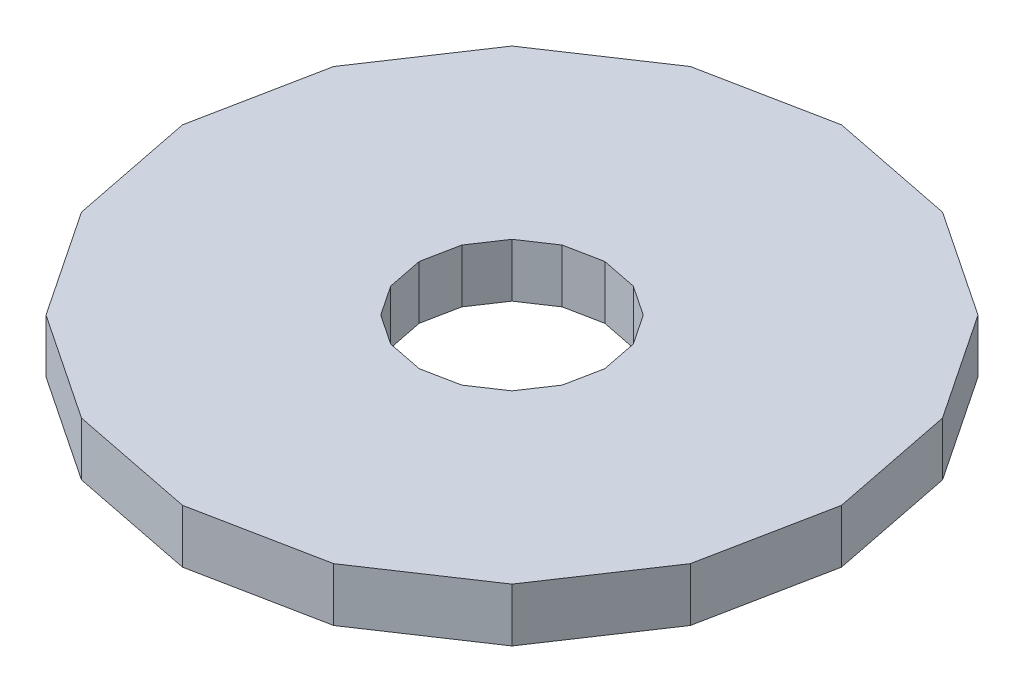
ISO-10303-21;
HEADER;
FILE_DESCRIPTION(('STEP AP214'),'2;1');
FILE_NAME('part.step','',(''),(''),'','','');
FILE_SCHEMA(('AUTOMOTIVE_DESIGN { 1 0 10303 214 1 1 1 1 }'));
ENDSEC;
DATA;
#1=APPLICATION_CONTEXT('core data for automotive mechanical design processes');
#2=APPLICATION_PROTOCOL_DEFINITION('international standard','automotive_design',2000,#1);
#3=PRODUCT_CONTEXT('',#1,'mechanical');
#4=PRODUCT('Part','Part','',(#3));
#5=PRODUCT_RELATED_PRODUCT_CATEGORY('part','',(#4));
#6=PRODUCT_DEFINITION_FORMATION('','',#4);
#7=PRODUCT_DEFINITION_CONTEXT('part definition',#1,'design');
#8=PRODUCT_DEFINITION('design','',#6,#7);
#9=PRODUCT_DEFINITION_SHAPE('','',#8);
#10=(LENGTH_UNIT() NAMED_UNIT(*) SI_UNIT(.MILLI.,.METRE.));
#11=(NAMED_UNIT(*) PLANE_ANGLE_UNIT() SI_UNIT($,.RADIAN.));
#12=(NAMED_UNIT(*) SI_UNIT($,.STERADIAN.) SOLID_ANGLE_UNIT());
#13=UNCERTAINTY_MEASURE_WITH_UNIT(LENGTH_MEASURE(1.E-05),#10,'distance_accuracy_value','');
#14=(GEOMETRIC_REPRESENTATION_CONTEXT(3) GLOBAL_UNCERTAINTY_ASSIGNED_CONTEXT((#13)) GLOBAL_UNIT_ASSIGNED_CONTEXT((#10,
#11,#12)) REPRESENTATION_CONTEXT('',''));
#15=CARTESIAN_POINT('',(0.,0.,0.));
#16=DIRECTION('',(0.,0.,1.));
#17=DIRECTION('',(1.,0.,0.));
#18=AXIS2_PLACEMENT_3D('',#15,#16,#17);
#19=CARTESIAN_POINT('',(0.,19.05,0.));
#20=DIRECTION('',(0.,1.,0.));
#21=DIRECTION('',(0.,0.,1.));
#22=AXIS2_PLACEMENT_3D('',#19,#20,#21);
#23=PLANE('',#22);
#24=DIRECTION('',(0.195090322016117,0.,-0.980785280403233));
#25=VECTOR('',#24,1.);
#26=CARTESIAN_POINT('',(108.256964748165,19.05,44.8415030200345));
#27=LINE('',#26,#25);
#28=CARTESIAN_POINT('',(108.256964748165,19.05,44.8415030200345));
#29=VERTEX_POINT('',#28);
#30=CARTESIAN_POINT('',(117.176494270742,19.05,-1.33573715514302E-12));
#31=VERTEX_POINT('',#30);
#32=EDGE_CURVE('E386',#29,#31,#27,.T.);
#33=ORIENTED_EDGE('',*,*,#32,.T.);
#34=DIRECTION('',(-0.195090322016139,0.,-0.980785280403228));
#35=VECTOR('',#34,1.);
#36=CARTESIAN_POINT('',(117.176494270742,19.05,-1.33573715514302E-12));
#37=LINE('',#36,#35);
#38=CARTESIAN_POINT('',(108.256964748164,19.05,-44.8415030200369));
#39=VERTEX_POINT('',#38);
#40=EDGE_CURVE('E390',#31,#39,#37,.T.);
#41=ORIENTED_EDGE('',*,*,#40,.T.);
#42=DIRECTION('',(-0.555570233019612,0.,-0.831469612302539));
#43=VECTOR('',#42,1.);
#44=CARTESIAN_POINT('',(108.256964748164,19.05,-44.8415030200369));
#45=LINE('',#44,#43);
#46=CARTESIAN_POINT('',(82.8562936945071,19.05,-82.856293694509));
#47=VERTEX_POINT('',#46);
#48=EDGE_CURVE('E394',#39,#47,#45,.T.);
#49=ORIENTED_EDGE('',*,*,#48,.T.);
#50=DIRECTION('',(-0.831469612302552,0.,-0.555570233019593));
#51=VECTOR('',#50,1.);
#52=CARTESIAN_POINT('',(82.8562936945071,19.05,-82.856293694509));
#53=LINE('',#52,#51);
#54=CARTESIAN_POINT('',(44.8415030200344,19.05,-108.256964748165));
#55=VERTEX_POINT('',#54);
#56=EDGE_CURVE('E396',#47,#55,#53,.T.);
#57=ORIENTED_EDGE('',*,*,#56,.T.);
#58=DIRECTION('',(-0.980785280403233,0.,-0.195090322016117));
#59=VECTOR('',#58,1.);
#60=CARTESIAN_POINT('',(44.8415030200344,19.05,-108.256964748165));
#61=LINE('',#60,#59);
#62=CARTESIAN_POINT('',(-1.38979967101952E-12,19.05,-117.176494270742));
#63=VERTEX_POINT('',#62);
#64=EDGE_CURVE('E399',#55,#63,#61,.T.);
#65=ORIENTED_EDGE('',*,*,#64,.T.);
#66=DIRECTION('',(-0.980785280403228,0.,0.195090322016139));
#67=VECTOR('',#66,1.);
#68=CARTESIAN_POINT('',(-1.38979967101952E-12,19.05,-117.176494270742));
#69=LINE('',#68,#67);
#70=CARTESIAN_POINT('',(-44.8415030200369,19.05,-108.256964748164));
#71=VERTEX_POINT('',#70);
#72=EDGE_CURVE('E401',#63,#71,#69,.T.);
#73=ORIENTED_EDGE('',*,*,#72,.T.);
#74=DIRECTION('',(-0.831469612302539,0.,0.555570233019612));
#75=VECTOR('',#74,1.);
#76=CARTESIAN_POINT('',(-44.8415030200369,19.05,-108.256964748164));
#77=LINE('',#76,#75);
#78=CARTESIAN_POINT('',(-82.856293694509,19.05,-82.8562936945071));
#79=VERTEX_POINT('',#78);
#80=EDGE_CURVE('E403',#71,#79,#77,.T.);
#81=ORIENTED_EDGE('',*,*,#80,.T.);
#82=DIRECTION('',(-0.555570233019593,0.,0.831469612302552));
#83=VECTOR('',#82,1.);
#84=CARTESIAN_POINT('',(-82.856293694509,19.05,-82.8562936945071));
#85=LINE('',#84,#83);
#86=CARTESIAN_POINT('',(-108.256964748165,19.05,-44.8415030200344));
#87=VERTEX_POINT('',#86);
#88=EDGE_CURVE('E405',#79,#87,#85,.T.);
#89=ORIENTED_EDGE('',*,*,#88,.T.);
#90=DIRECTION('',(-0.195090322016117,0.,0.980785280403233));
#91=VECTOR('',#90,1.);
#92=CARTESIAN_POINT('',(-108.256964748165,19.05,-44.8415030200344));
#93=LINE('',#92,#91);
#94=CARTESIAN_POINT('',(-117.176494270742,19.05,1.34356038253179E-12));
#95=VERTEX_POINT('',#94);
#96=EDGE_CURVE('E407',#87,#95,#93,.T.);
#97=ORIENTED_EDGE('',*,*,#96,.T.);
#98=DIRECTION('',(0.195090322016139,0.,0.980785280403228));
#99=VECTOR('',#98,1.);
#100=CARTESIAN_POINT('',(-117.176494270742,19.05,1.34356038253179E-12));
#101=LINE('',#100,#99);
#102=CARTESIAN_POINT('',(-108.256964748164,19.05,44.8415030200369));
#103=VERTEX_POINT('',#102);
#104=EDGE_CURVE('E410',#95,#103,#101,.T.);
#105=ORIENTED_EDGE('',*,*,#104,.T.);
#106=DIRECTION('',(0.555570233019612,0.,0.831469612302539));
#107=VECTOR('',#106,1.);
#108=CARTESIAN_POINT('',(-108.256964748164,19.05,44.8415030200369));
#109=LINE('',#108,#107);
#110=CARTESIAN_POINT('',(-82.8562936945071,19.05,82.856293694509));
#111=VERTEX_POINT('',#110);
#112=EDGE_CURVE('E413',#103,#111,#109,.T.);
#113=ORIENTED_EDGE('',*,*,#112,.T.);
#114=DIRECTION('',(0.831469612302552,0.,0.555570233019593));
#115=VECTOR('',#114,1.);
#116=CARTESIAN_POINT('',(-82.8562936945071,19.05,82.856293694509));
#117=LINE('',#116,#115);
#118=CARTESIAN_POINT('',(-44.8415030200344,19.05,108.256964748165));
#119=VERTEX_POINT('',#118);
#120=EDGE_CURVE('E415',#111,#119,#117,.T.);
#121=ORIENTED_EDGE('',*,*,#120,.T.);
#122=DIRECTION('',(0.980785280403233,0.,0.195090322016117));
#123=VECTOR('',#122,1.);
#124=CARTESIAN_POINT('',(-44.8415030200344,19.05,108.256964748165));
#125=LINE('',#124,#123);
#126=CARTESIAN_POINT('',(1.33354802444616E-12,19.05,117.176494270742));
#127=VERTEX_POINT('',#126);
#128=EDGE_CURVE('E417',#119,#127,#125,.T.);
#129=ORIENTED_EDGE('',*,*,#128,.T.);
#130=DIRECTION('',(0.980785280403228,0.,-0.195090322016139));
#131=VECTOR('',#130,1.);
#132=CARTESIAN_POINT('',(1.33354802444616E-12,19.05,117.176494270742));
#133=LINE('',#132,#131);
#134=CARTESIAN_POINT('',(44.8415030200369,19.05,108.256964748164));
#135=VERTEX_POINT('',#134);
#136=EDGE_CURVE('E419',#127,#135,#133,.T.);
#137=ORIENTED_EDGE('',*,*,#136,.T.);
#138=DIRECTION('',(0.831469612302539,0.,-0.555570233019612));
#139=VECTOR('',#138,1.);
#140=CARTESIAN_POINT('',(44.8415030200369,19.05,108.256964748164));
#141=LINE('',#140,#139);
#142=CARTESIAN_POINT('',(82.856293694509,19.05,82.8562936945071));
#143=VERTEX_POINT('',#142);
#144=EDGE_CURVE('E422',#135,#143,#141,.T.);
#145=ORIENTED_EDGE('',*,*,#144,.T.);
#146=DIRECTION('',(0.555570233019593,0.,-0.831469612302552));
#147=VECTOR('',#146,1.);
#148=CARTESIAN_POINT('',(82.856293694509,19.05,82.8562936945071));
#149=LINE('',#148,#147);
#150=EDGE_CURVE('E424',#143,#29,#149,.T.);
#151=ORIENTED_EDGE('',*,*,#150,.T.);
#152=EDGE_LOOP('',(#33,#41,#49,#57,#65,#73,#81,#89,#97,#105,#113,#121,#129,#137,#145,#151));
#153=FACE_BOUND('',#152,.T.);
#154=DIRECTION('',(-0.195090322016139,0.,-0.980785280403228));
#155=VECTOR('',#154,1.);
#156=CARTESIAN_POINT('',(33.009244160645,19.05,-3.95802355613758E-13));
#157=LINE('',#156,#155);
#158=CARTESIAN_POINT('',(33.009244160645,19.05,-3.95802355613758E-13));
#159=VERTEX_POINT('',#158);
#160=CARTESIAN_POINT('',(30.4965650636875,19.05,-12.6320908551732));
#161=VERTEX_POINT('',#160);
#162=EDGE_CURVE('E252',#159,#161,#157,.T.);
#163=ORIENTED_EDGE('',*,*,#162,.F.);
#164=DIRECTION('',(0.195090322016116,0.,-0.980785280403233));
#165=VECTOR('',#164,1.);
#166=CARTESIAN_POINT('',(30.4965650636878,19.05,12.6320908551726));
#167=LINE('',#166,#165);
#168=CARTESIAN_POINT('',(30.4965650636878,19.05,12.6320908551726));
#169=VERTEX_POINT('',#168);
#170=EDGE_CURVE('E243',#169,#159,#167,.T.);
#171=ORIENTED_EDGE('',*,*,#170,.F.);
#172=DIRECTION('',(0.555570233019593,0.,-0.831469612302551));
#173=VECTOR('',#172,1.);
#174=CARTESIAN_POINT('',(23.3410603878348,19.05,23.3410603878342));
#175=LINE('',#174,#173);
#176=CARTESIAN_POINT('',(23.3410603878348,19.05,23.3410603878342));
#177=VERTEX_POINT('',#176);
#178=EDGE_CURVE('E299',#177,#169,#175,.T.);
#179=ORIENTED_EDGE('',*,*,#178,.F.);
#180=DIRECTION('',(0.831469612302539,0.,-0.555570233019612));
#181=VECTOR('',#180,1.);
#182=CARTESIAN_POINT('',(12.6320908551733,19.05,30.4965650636874));
#183=LINE('',#182,#181);
#184=CARTESIAN_POINT('',(12.6320908551733,19.05,30.4965650636874));
#185=VERTEX_POINT('',#184);
#186=EDGE_CURVE('E296',#185,#177,#183,.T.);
#187=ORIENTED_EDGE('',*,*,#186,.F.);
#188=DIRECTION('',(0.980785280403228,0.,-0.19509032201614));
#189=VECTOR('',#188,1.);
#190=CARTESIAN_POINT('',(3.95157555062701E-13,19.05,33.009244160645));
#191=LINE('',#190,#189);
#192=CARTESIAN_POINT('',(3.95157555062701E-13,19.05,33.009244160645));
#193=VERTEX_POINT('',#192);
#194=EDGE_CURVE('E293',#193,#185,#191,.T.);
#195=ORIENTED_EDGE('',*,*,#194,.F.);
#196=DIRECTION('',(0.980785280403233,0.,0.195090322016117));
#197=VECTOR('',#196,1.);
#198=CARTESIAN_POINT('',(-12.6320908551726,19.05,30.4965650636877));
#199=LINE('',#198,#197);
#200=CARTESIAN_POINT('',(-12.6320908551726,19.05,30.4965650636877));
#201=VERTEX_POINT('',#200);
#202=EDGE_CURVE('E291',#201,#193,#199,.T.);
#203=ORIENTED_EDGE('',*,*,#202,.F.);
#204=DIRECTION('',(0.831469612302552,0.,0.555570233019593));
#205=VECTOR('',#204,1.);
#206=CARTESIAN_POINT('',(-23.3410603878342,19.05,23.3410603878348));
#207=LINE('',#206,#205);
#208=CARTESIAN_POINT('',(-23.3410603878342,19.05,23.3410603878348));
#209=VERTEX_POINT('',#208);
#210=EDGE_CURVE('E288',#209,#201,#207,.T.);
#211=ORIENTED_EDGE('',*,*,#210,.F.);
#212=DIRECTION('',(0.555570233019612,0.,0.831469612302539));
#213=VECTOR('',#212,1.);
#214=CARTESIAN_POINT('',(-30.4965650636874,19.05,12.6320908551733));
#215=LINE('',#214,#213);
#216=CARTESIAN_POINT('',(-30.4965650636874,19.05,12.6320908551733));
#217=VERTEX_POINT('',#216);
#218=EDGE_CURVE('E286',#217,#209,#215,.T.);
#219=ORIENTED_EDGE('',*,*,#218,.F.);
#220=DIRECTION('',(0.19509032201614,0.,0.980785280403228));
#221=VECTOR('',#220,1.);
#222=CARTESIAN_POINT('',(-33.0092441606449,19.05,4.0163981252167E-13));
#223=LINE('',#222,#221);
#224=CARTESIAN_POINT('',(-33.0092441606449,19.05,4.0163981252167E-13));
#225=VERTEX_POINT('',#224);
#226=EDGE_CURVE('E283',#225,#217,#223,.T.);
#227=ORIENTED_EDGE('',*,*,#226,.F.);
#228=DIRECTION('',(-0.195090322016116,0.,0.980785280403233));
#229=VECTOR('',#228,1.);
#230=CARTESIAN_POINT('',(-30.4965650636877,19.05,-12.6320908551725));
#231=LINE('',#230,#229);
#232=CARTESIAN_POINT('',(-30.4965650636877,19.05,-12.6320908551725));
#233=VERTEX_POINT('',#232);
#234=EDGE_CURVE('E281',#233,#225,#231,.T.);
#235=ORIENTED_EDGE('',*,*,#234,.F.);
#236=DIRECTION('',(-0.555570233019593,0.,0.831469612302552));
#237=VECTOR('',#236,1.);
#238=CARTESIAN_POINT('',(-23.3410603878348,19.05,-23.3410603878342));
#239=LINE('',#238,#237);
#240=CARTESIAN_POINT('',(-23.3410603878348,19.05,-23.3410603878342));
#241=VERTEX_POINT('',#240);
#242=EDGE_CURVE('E279',#241,#233,#239,.T.);
#243=ORIENTED_EDGE('',*,*,#242,.F.);
#244=DIRECTION('',(-0.831469612302539,0.,0.555570233019612));
#245=VECTOR('',#244,1.);
#246=CARTESIAN_POINT('',(-12.6320908551733,19.05,-30.4965650636874));
#247=LINE('',#246,#245);
#248=CARTESIAN_POINT('',(-12.6320908551733,19.05,-30.4965650636874));
#249=VERTEX_POINT('',#248);
#250=EDGE_CURVE('E276',#249,#241,#247,.T.);
#251=ORIENTED_EDGE('',*,*,#250,.F.);
#252=DIRECTION('',(-0.980785280403228,0.,0.19509032201614));
#253=VECTOR('',#252,1.);
#254=CARTESIAN_POINT('',(-4.20654343301771E-13,19.05,-33.0092441606449));
#255=LINE('',#254,#253);
#256=CARTESIAN_POINT('',(-4.20654343301771E-13,19.05,-33.0092441606449));
#257=VERTEX_POINT('',#256);
#258=EDGE_CURVE('E274',#257,#249,#255,.T.);
#259=ORIENTED_EDGE('',*,*,#258,.F.);
#260=DIRECTION('',(-0.980785280403233,0.,-0.195090322016116));
#261=VECTOR('',#260,1.);
#262=CARTESIAN_POINT('',(12.6320908551727,19.05,-30.4965650636877));
#263=LINE('',#262,#261);
#264=CARTESIAN_POINT('',(12.6320908551727,19.05,-30.4965650636877));
#265=VERTEX_POINT('',#264);
#266=EDGE_CURVE('E272',#265,#257,#263,.T.);
#267=ORIENTED_EDGE('',*,*,#266,.F.);
#268=DIRECTION('',(-0.831469612302552,0.,-0.555570233019593));
#269=VECTOR('',#268,1.);
#270=CARTESIAN_POINT('',(23.3410603878342,19.05,-23.3410603878348));
#271=LINE('',#270,#269);
#272=CARTESIAN_POINT('',(23.3410603878342,19.05,-23.3410603878348));
#273=VERTEX_POINT('',#272);
#274=EDGE_CURVE('E268',#273,#265,#271,.T.);
#275=ORIENTED_EDGE('',*,*,#274,.F.);
#276=DIRECTION('',(-0.555570233019612,0.,-0.831469612302538));
#277=VECTOR('',#276,1.);
#278=CARTESIAN_POINT('',(30.4965650636875,19.05,-12.6320908551732));
#279=LINE('',#278,#277);
#280=EDGE_CURVE('E266',#161,#273,#279,.T.);
#281=ORIENTED_EDGE('',*,*,#280,.F.);
#282=EDGE_LOOP('',(#163,#171,#179,#187,#195,#203,#211,#219,#227,#235,#243,#251,#259,#267,#275,#281));
#283=FACE_BOUND('',#282,.T.);
#284=ADVANCED_FACE('F34',(#153,#283),#23,.T.);
#285=CARTESIAN_POINT('',(0.,0.,0.));
#286=DIRECTION('',(0.,1.,0.));
#287=DIRECTION('',(0.,0.,1.));
#288=AXIS2_PLACEMENT_3D('',#285,#286,#287);
#289=PLANE('',#288);
#290=DIRECTION('',(0.195090322016117,0.,-0.980785280403233));
#291=VECTOR('',#290,1.);
#292=CARTESIAN_POINT('',(108.256964748165,0.,44.8415030200345));
#293=LINE('',#292,#291);
#294=CARTESIAN_POINT('',(108.256964748165,0.,44.8415030200345));
#295=VERTEX_POINT('',#294);
#296=CARTESIAN_POINT('',(117.176494270742,0.,-1.33573715514302E-12));
#297=VERTEX_POINT('',#296);
#298=EDGE_CURVE('E261',#295,#297,#293,.T.);
#299=ORIENTED_EDGE('',*,*,#298,.F.);
#300=DIRECTION('',(0.555570233019593,0.,-0.831469612302552));
#301=VECTOR('',#300,1.);
#302=CARTESIAN_POINT('',(82.856293694509,0.,82.8562936945071));
#303=LINE('',#302,#301);
#304=CARTESIAN_POINT('',(82.856293694509,0.,82.8562936945071));
#305=VERTEX_POINT('',#304);
#306=EDGE_CURVE('E391',#305,#295,#303,.T.);
#307=ORIENTED_EDGE('',*,*,#306,.F.);
#308=DIRECTION('',(0.831469612302539,0.,-0.555570233019612));
#309=VECTOR('',#308,1.);
#310=CARTESIAN_POINT('',(44.8415030200369,0.,108.256964748164));
#311=LINE('',#310,#309);
#312=CARTESIAN_POINT('',(44.8415030200369,0.,108.256964748164));
#313=VERTEX_POINT('',#312);
#314=EDGE_CURVE('E459',#313,#305,#311,.T.);
#315=ORIENTED_EDGE('',*,*,#314,.F.);
#316=DIRECTION('',(0.980785280403228,0.,-0.195090322016139));
#317=VECTOR('',#316,1.);
#318=CARTESIAN_POINT('',(1.33354802444616E-12,0.,117.176494270742));
#319=LINE('',#318,#317);
#320=CARTESIAN_POINT('',(1.33354802444616E-12,0.,117.176494270742));
#321=VERTEX_POINT('',#320);
#322=EDGE_CURVE('E457',#321,#313,#319,.T.);
#323=ORIENTED_EDGE('',*,*,#322,.F.);
#324=DIRECTION('',(0.980785280403233,0.,0.195090322016117));
#325=VECTOR('',#324,1.);
#326=CARTESIAN_POINT('',(-44.8415030200344,0.,108.256964748165));
#327=LINE('',#326,#325);
#328=CARTESIAN_POINT('',(-44.8415030200344,0.,108.256964748165));
#329=VERTEX_POINT('',#328);
#330=EDGE_CURVE('E454',#329,#321,#327,.T.);
#331=ORIENTED_EDGE('',*,*,#330,.F.);
#332=DIRECTION('',(0.831469612302552,0.,0.555570233019593));
#333=VECTOR('',#332,1.);
#334=CARTESIAN_POINT('',(-82.8562936945071,0.,82.856293694509));
#335=LINE('',#334,#333);
#336=CARTESIAN_POINT('',(-82.8562936945071,0.,82.856293694509));
#337=VERTEX_POINT('',#336);
#338=EDGE_CURVE('E451',#337,#329,#335,.T.);
#339=ORIENTED_EDGE('',*,*,#338,.F.);
#340=DIRECTION('',(0.555570233019612,0.,0.831469612302539));
#341=VECTOR('',#340,1.);
#342=CARTESIAN_POINT('',(-108.256964748164,0.,44.8415030200369));
#343=LINE('',#342,#341);
#344=CARTESIAN_POINT('',(-108.256964748164,0.,44.8415030200369));
#345=VERTEX_POINT('',#344);
#346=EDGE_CURVE('E449',#345,#337,#343,.T.);
#347=ORIENTED_EDGE('',*,*,#346,.F.);
#348=DIRECTION('',(0.195090322016139,0.,0.980785280403228));
#349=VECTOR('',#348,1.);
#350=CARTESIAN_POINT('',(-117.176494270742,0.,1.34356038253179E-12));
#351=LINE('',#350,#349);
#352=CARTESIAN_POINT('',(-117.176494270742,0.,1.34356038253179E-12));
#353=VERTEX_POINT('',#352);
#354=EDGE_CURVE('E447',#353,#345,#351,.T.);
#355=ORIENTED_EDGE('',*,*,#354,.F.);
#356=DIRECTION('',(-0.195090322016117,0.,0.980785280403233));
#357=VECTOR('',#356,1.);
#358=CARTESIAN_POINT('',(-108.256964748165,0.,-44.8415030200344));
#359=LINE('',#358,#357);
#360=CARTESIAN_POINT('',(-108.256964748165,0.,-44.8415030200344));
#361=VERTEX_POINT('',#360);
#362=EDGE_CURVE('E445',#361,#353,#359,.T.);
#363=ORIENTED_EDGE('',*,*,#362,.F.);
#364=DIRECTION('',(-0.555570233019593,0.,0.831469612302552));
#365=VECTOR('',#364,1.);
#366=CARTESIAN_POINT('',(-82.856293694509,0.,-82.8562936945071));
#367=LINE('',#366,#365);
#368=CARTESIAN_POINT('',(-82.856293694509,0.,-82.8562936945071));
#369=VERTEX_POINT('',#368);
#370=EDGE_CURVE('E443',#369,#361,#367,.T.);
#371=ORIENTED_EDGE('',*,*,#370,.F.);
#372=DIRECTION('',(-0.831469612302539,0.,0.555570233019612));
#373=VECTOR('',#372,1.);
#374=CARTESIAN_POINT('',(-44.8415030200369,0.,-108.256964748164));
#375=LINE('',#374,#373);
#376=CARTESIAN_POINT('',(-44.8415030200369,0.,-108.256964748164));
#377=VERTEX_POINT('',#376);
#378=EDGE_CURVE('E441',#377,#369,#375,.T.);
#379=ORIENTED_EDGE('',*,*,#378,.F.);
#380=DIRECTION('',(-0.980785280403228,0.,0.195090322016139));
#381=VECTOR('',#380,1.);
#382=CARTESIAN_POINT('',(-1.38979967101952E-12,0.,-117.176494270742));
#383=LINE('',#382,#381);
#384=CARTESIAN_POINT('',(-1.38979967101952E-12,0.,-117.176494270742));
#385=VERTEX_POINT('',#384);
#386=EDGE_CURVE('E439',#385,#377,#383,.T.);
#387=ORIENTED_EDGE('',*,*,#386,.F.);
#388=DIRECTION('',(-0.980785280403233,0.,-0.195090322016117));
#389=VECTOR('',#388,1.);
#390=CARTESIAN_POINT('',(44.8415030200344,0.,-108.256964748165));
#391=LINE('',#390,#389);
#392=CARTESIAN_POINT('',(44.8415030200344,0.,-108.256964748165));
#393=VERTEX_POINT('',#392);
#394=EDGE_CURVE('E437',#393,#385,#391,.T.);
#395=ORIENTED_EDGE('',*,*,#394,.F.);
#396=DIRECTION('',(-0.831469612302552,0.,-0.555570233019593));
#397=VECTOR('',#396,1.);
#398=CARTESIAN_POINT('',(82.8562936945071,0.,-82.856293694509));
#399=LINE('',#398,#397);
#400=CARTESIAN_POINT('',(82.8562936945071,0.,-82.856293694509));
#401=VERTEX_POINT('',#400);
#402=EDGE_CURVE('E435',#401,#393,#399,.T.);
#403=ORIENTED_EDGE('',*,*,#402,.F.);
#404=DIRECTION('',(-0.555570233019612,0.,-0.831469612302539));
#405=VECTOR('',#404,1.);
#406=CARTESIAN_POINT('',(108.256964748164,0.,-44.8415030200369));
#407=LINE('',#406,#405);
#408=CARTESIAN_POINT('',(108.256964748164,0.,-44.8415030200369));
#409=VERTEX_POINT('',#408);
#410=EDGE_CURVE('E433',#409,#401,#407,.T.);
#411=ORIENTED_EDGE('',*,*,#410,.F.);
#412=DIRECTION('',(-0.195090322016139,0.,-0.980785280403228));
#413=VECTOR('',#412,1.);
#414=CARTESIAN_POINT('',(117.176494270742,0.,-1.33573715514302E-12));
#415=LINE('',#414,#413);
#416=EDGE_CURVE('E430',#297,#409,#415,.T.);
#417=ORIENTED_EDGE('',*,*,#416,.F.);
#418=EDGE_LOOP('',(#299,#307,#315,#323,#331,#339,#347,#355,#363,#371,#379,#387,#395,#403,#411,#417));
#419=FACE_BOUND('',#418,.T.);
#420=DIRECTION('',(0.195090322016116,0.,-0.980785280403233));
#421=VECTOR('',#420,1.);
#422=CARTESIAN_POINT('',(30.4965650636878,0.,12.6320908551726));
#423=LINE('',#422,#421);
#424=CARTESIAN_POINT('',(30.4965650636878,0.,12.6320908551726));
#425=VERTEX_POINT('',#424);
#426=CARTESIAN_POINT('',(33.009244160645,0.,-3.95802355613758E-13));
#427=VERTEX_POINT('',#426);
#428=EDGE_CURVE('E57',#425,#427,#423,.T.);
#429=ORIENTED_EDGE('',*,*,#428,.T.);
#430=DIRECTION('',(-0.195090322016139,0.,-0.980785280403228));
#431=VECTOR('',#430,1.);
#432=CARTESIAN_POINT('',(33.009244160645,0.,-3.95802355613758E-13));
#433=LINE('',#432,#431);
#434=CARTESIAN_POINT('',(30.4965650636875,0.,-12.6320908551732));
#435=VERTEX_POINT('',#434);
#436=EDGE_CURVE('E259',#427,#435,#433,.T.);
#437=ORIENTED_EDGE('',*,*,#436,.T.);
#438=DIRECTION('',(-0.555570233019612,0.,-0.831469612302538));
#439=VECTOR('',#438,1.);
#440=CARTESIAN_POINT('',(30.4965650636875,0.,-12.6320908551732));
#441=LINE('',#440,#439);
#442=CARTESIAN_POINT('',(23.3410603878342,0.,-23.3410603878348));
#443=VERTEX_POINT('',#442);
#444=EDGE_CURVE('E304',#435,#443,#441,.T.);
#445=ORIENTED_EDGE('',*,*,#444,.T.);
#446=DIRECTION('',(-0.831469612302552,0.,-0.555570233019593));
#447=VECTOR('',#446,1.);
#448=CARTESIAN_POINT('',(23.3410603878342,0.,-23.3410603878348));
#449=LINE('',#448,#447);
#450=CARTESIAN_POINT('',(12.6320908551727,0.,-30.4965650636877));
#451=VERTEX_POINT('',#450);
#452=EDGE_CURVE('E308',#443,#451,#449,.T.);
#453=ORIENTED_EDGE('',*,*,#452,.T.);
#454=DIRECTION('',(-0.980785280403233,0.,-0.195090322016116));
#455=VECTOR('',#454,1.);
#456=CARTESIAN_POINT('',(12.6320908551727,0.,-30.4965650636877));
#457=LINE('',#456,#455);
#458=CARTESIAN_POINT('',(-4.20654343301771E-13,0.,-33.0092441606449));
#459=VERTEX_POINT('',#458);
#460=EDGE_CURVE('E311',#451,#459,#457,.T.);
#461=ORIENTED_EDGE('',*,*,#460,.T.);
#462=DIRECTION('',(-0.980785280403228,0.,0.19509032201614));
#463=VECTOR('',#462,1.);
#464=CARTESIAN_POINT('',(-4.20654343301771E-13,0.,-33.0092441606449));
#465=LINE('',#464,#463);
#466=CARTESIAN_POINT('',(-12.6320908551733,0.,-30.4965650636874));
#467=VERTEX_POINT('',#466);
#468=EDGE_CURVE('E314',#459,#467,#465,.T.);
#469=ORIENTED_EDGE('',*,*,#468,.T.);
#470=DIRECTION('',(-0.831469612302539,0.,0.555570233019612));
#471=VECTOR('',#470,1.);
#472=CARTESIAN_POINT('',(-12.6320908551733,0.,-30.4965650636874));
#473=LINE('',#472,#471);
#474=CARTESIAN_POINT('',(-23.3410603878348,0.,-23.3410603878342));
#475=VERTEX_POINT('',#474);
#476=EDGE_CURVE('E317',#467,#475,#473,.T.);
#477=ORIENTED_EDGE('',*,*,#476,.T.);
#478=DIRECTION('',(-0.555570233019593,0.,0.831469612302552));
#479=VECTOR('',#478,1.);
#480=CARTESIAN_POINT('',(-23.3410603878348,0.,-23.3410603878342));
#481=LINE('',#480,#479);
#482=CARTESIAN_POINT('',(-30.4965650636877,0.,-12.6320908551725));
#483=VERTEX_POINT('',#482);
#484=EDGE_CURVE('E321',#475,#483,#481,.T.);
#485=ORIENTED_EDGE('',*,*,#484,.T.);
#486=DIRECTION('',(-0.195090322016116,0.,0.980785280403233));
#487=VECTOR('',#486,1.);
#488=CARTESIAN_POINT('',(-30.4965650636877,0.,-12.6320908551725));
#489=LINE('',#488,#487);
#490=CARTESIAN_POINT('',(-33.0092441606449,0.,4.0163981252167E-13));
#491=VERTEX_POINT('',#490);
#492=EDGE_CURVE('E325',#483,#491,#489,.T.);
#493=ORIENTED_EDGE('',*,*,#492,.T.);
#494=DIRECTION('',(0.19509032201614,0.,0.980785280403228));
#495=VECTOR('',#494,1.);
#496=CARTESIAN_POINT('',(-33.0092441606449,0.,4.0163981252167E-13));
#497=LINE('',#496,#495);
#498=CARTESIAN_POINT('',(-30.4965650636874,0.,12.6320908551733));
#499=VERTEX_POINT('',#498);
#500=EDGE_CURVE('E329',#491,#499,#497,.T.);
#501=ORIENTED_EDGE('',*,*,#500,.T.);
#502=DIRECTION('',(0.555570233019612,0.,0.831469612302539));
#503=VECTOR('',#502,1.);
#504=CARTESIAN_POINT('',(-30.4965650636874,0.,12.6320908551733));
#505=LINE('',#504,#503);
#506=CARTESIAN_POINT('',(-23.3410603878342,0.,23.3410603878348));
#507=VERTEX_POINT('',#506);
#508=EDGE_CURVE('E332',#499,#507,#505,.T.);
#509=ORIENTED_EDGE('',*,*,#508,.T.);
#510=DIRECTION('',(0.831469612302552,0.,0.555570233019593));
#511=VECTOR('',#510,1.);
#512=CARTESIAN_POINT('',(-23.3410603878342,0.,23.3410603878348));
#513=LINE('',#512,#511);
#514=CARTESIAN_POINT('',(-12.6320908551726,0.,30.4965650636877));
#515=VERTEX_POINT('',#514);
#516=EDGE_CURVE('E335',#507,#515,#513,.T.);
#517=ORIENTED_EDGE('',*,*,#516,.T.);
#518=DIRECTION('',(0.980785280403233,0.,0.195090322016117));
#519=VECTOR('',#518,1.);
#520=CARTESIAN_POINT('',(-12.6320908551726,0.,30.4965650636877));
#521=LINE('',#520,#519);
#522=CARTESIAN_POINT('',(3.95157555062701E-13,0.,33.009244160645));
#523=VERTEX_POINT('',#522);
#524=EDGE_CURVE('E339',#515,#523,#521,.T.);
#525=ORIENTED_EDGE('',*,*,#524,.T.);
#526=DIRECTION('',(0.980785280403228,0.,-0.19509032201614));
#527=VECTOR('',#526,1.);
#528=CARTESIAN_POINT('',(3.95157555062701E-13,0.,33.009244160645));
#529=LINE('',#528,#527);
#530=CARTESIAN_POINT('',(12.6320908551733,0.,30.4965650636874));
#531=VERTEX_POINT('',#530);
#532=EDGE_CURVE('E343',#523,#531,#529,.T.);
#533=ORIENTED_EDGE('',*,*,#532,.T.);
#534=DIRECTION('',(0.831469612302539,0.,-0.555570233019612));
#535=VECTOR('',#534,1.);
#536=CARTESIAN_POINT('',(12.6320908551733,0.,30.4965650636874));
#537=LINE('',#536,#535);
#538=CARTESIAN_POINT('',(23.3410603878348,0.,23.3410603878342));
#539=VERTEX_POINT('',#538);
#540=EDGE_CURVE('E347',#531,#539,#537,.T.);
#541=ORIENTED_EDGE('',*,*,#540,.T.);
#542=DIRECTION('',(0.555570233019593,0.,-0.831469612302551));
#543=VECTOR('',#542,1.);
#544=CARTESIAN_POINT('',(23.3410603878348,0.,23.3410603878342));
#545=LINE('',#544,#543);
#546=EDGE_CURVE('E253',#539,#425,#545,.T.);
#547=ORIENTED_EDGE('',*,*,#546,.T.);
#548=EDGE_LOOP('',(#429,#437,#445,#453,#461,#469,#477,#485,#493,#501,#509,#517,#525,#533,#541,#547));
#549=FACE_BOUND('',#548,.T.);
#550=ADVANCED_FACE('F518',(#419,#549),#289,.F.);
#551=CARTESIAN_POINT('',(108.256964748165,19.05,44.8415030200345));
#552=DIRECTION('',(-0.980785280403233,0.,-0.195090322016117));
#553=DIRECTION('',(-0.195090322016117,0.,0.980785280403233));
#554=AXIS2_PLACEMENT_3D('',#551,#552,#553);
#555=PLANE('',#554);
#556=ORIENTED_EDGE('',*,*,#298,.T.);
#557=DIRECTION('',(0.,-1.,0.));
#558=VECTOR('',#557,1.);
#559=CARTESIAN_POINT('',(117.176494270742,19.05,-1.33573715514302E-12));
#560=LINE('',#559,#558);
#561=EDGE_CURVE('E11',#31,#297,#560,.T.);
#562=ORIENTED_EDGE('',*,*,#561,.F.);
#563=ORIENTED_EDGE('',*,*,#32,.F.);
#564=DIRECTION('',(0.,-1.,0.));
#565=VECTOR('',#564,1.);
#566=CARTESIAN_POINT('',(108.256964748165,19.05,44.8415030200345));
#567=LINE('',#566,#565);
#568=EDGE_CURVE('E426',#29,#295,#567,.T.);
#569=ORIENTED_EDGE('',*,*,#568,.T.);
#570=EDGE_LOOP('',(#556,#562,#563,#569));
#571=FACE_BOUND('',#570,.T.);
#572=ADVANCED_FACE('F36',(#571),#555,.F.);
#573=CARTESIAN_POINT('',(117.176494270742,19.05,-1.33573715514302E-12));
#574=DIRECTION('',(-0.980785280403228,0.,0.195090322016139));
#575=DIRECTION('',(0.195090322016139,0.,0.980785280403228));
#576=AXIS2_PLACEMENT_3D('',#573,#574,#575);
#577=PLANE('',#576);
#578=ORIENTED_EDGE('',*,*,#416,.T.);
#579=DIRECTION('',(0.,-1.,0.));
#580=VECTOR('',#579,1.);
#581=CARTESIAN_POINT('',(108.256964748164,19.05,-44.8415030200369));
#582=LINE('',#581,#580);
#583=EDGE_CURVE('E42',#39,#409,#582,.T.);
#584=ORIENTED_EDGE('',*,*,#583,.F.);
#585=ORIENTED_EDGE('',*,*,#40,.F.);
#586=ORIENTED_EDGE('',*,*,#561,.T.);
#587=EDGE_LOOP('',(#578,#584,#585,#586));
#588=FACE_BOUND('',#587,.T.);
#589=ADVANCED_FACE('F535',(#588),#577,.F.);
#590=CARTESIAN_POINT('',(108.256964748164,19.05,-44.8415030200369));
#591=DIRECTION('',(-0.831469612302539,0.,0.555570233019612));
#592=DIRECTION('',(0.555570233019612,0.,0.831469612302539));
#593=AXIS2_PLACEMENT_3D('',#590,#591,#592);
#594=PLANE('',#593);
#595=ORIENTED_EDGE('',*,*,#410,.T.);
#596=DIRECTION('',(0.,-1.,0.));
#597=VECTOR('',#596,1.);
#598=CARTESIAN_POINT('',(82.8562936945071,19.05,-82.856293694509));
#599=LINE('',#598,#597);
#600=EDGE_CURVE('E504',#47,#401,#599,.T.);
#601=ORIENTED_EDGE('',*,*,#600,.F.);
#602=ORIENTED_EDGE('',*,*,#48,.F.);
#603=ORIENTED_EDGE('',*,*,#583,.T.);
#604=EDGE_LOOP('',(#595,#601,#602,#603));
#605=FACE_BOUND('',#604,.T.);
#606=ADVANCED_FACE('F512',(#605),#594,.F.);
#607=CARTESIAN_POINT('',(82.8562936945071,19.05,-82.856293694509));
#608=DIRECTION('',(-0.555570233019593,0.,0.831469612302552));
#609=DIRECTION('',(0.831469612302552,0.,0.555570233019593));
#610=AXIS2_PLACEMENT_3D('',#607,#608,#609);
#611=PLANE('',#610);
#612=ORIENTED_EDGE('',*,*,#402,.T.);
#613=DIRECTION('',(0.,-1.,0.));
#614=VECTOR('',#613,1.);
#615=CARTESIAN_POINT('',(44.8415030200344,19.05,-108.256964748165));
#616=LINE('',#615,#614);
#617=EDGE_CURVE('E500',#55,#393,#616,.T.);
#618=ORIENTED_EDGE('',*,*,#617,.F.);
#619=ORIENTED_EDGE('',*,*,#56,.F.);
#620=ORIENTED_EDGE('',*,*,#600,.T.);
#621=EDGE_LOOP('',(#612,#618,#619,#620));
#622=FACE_BOUND('',#621,.T.);
#623=ADVANCED_FACE('F524',(#622),#611,.F.);
#624=CARTESIAN_POINT('',(44.8415030200344,19.05,-108.256964748165));
#625=DIRECTION('',(-0.195090322016117,0.,0.980785280403233));
#626=DIRECTION('',(0.980785280403233,0.,0.195090322016117));
#627=AXIS2_PLACEMENT_3D('',#624,#625,#626);
#628=PLANE('',#627);
#629=ORIENTED_EDGE('',*,*,#394,.T.);
#630=DIRECTION('',(0.,-1.,0.));
#631=VECTOR('',#630,1.);
#632=CARTESIAN_POINT('',(-1.38979967101952E-12,19.05,-117.176494270742));
#633=LINE('',#632,#631);
#634=EDGE_CURVE('E497',#63,#385,#633,.T.);
#635=ORIENTED_EDGE('',*,*,#634,.F.);
#636=ORIENTED_EDGE('',*,*,#64,.F.);
#637=ORIENTED_EDGE('',*,*,#617,.T.);
#638=EDGE_LOOP('',(#629,#635,#636,#637));
#639=FACE_BOUND('',#638,.T.);
#640=ADVANCED_FACE('F528',(#639),#628,.F.);
#641=CARTESIAN_POINT('',(-1.38979967101952E-12,19.05,-117.176494270742));
#642=DIRECTION('',(0.195090322016139,0.,0.980785280403228));
#643=DIRECTION('',(0.980785280403228,0.,-0.195090322016139));
#644=AXIS2_PLACEMENT_3D('',#641,#642,#643);
#645=PLANE('',#644);
#646=ORIENTED_EDGE('',*,*,#386,.T.);
#647=DIRECTION('',(0.,-1.,0.));
#648=VECTOR('',#647,1.);
#649=CARTESIAN_POINT('',(-44.8415030200369,19.05,-108.256964748164));
#650=LINE('',#649,#648);
#651=EDGE_CURVE('E494',#71,#377,#650,.T.);
#652=ORIENTED_EDGE('',*,*,#651,.F.);
#653=ORIENTED_EDGE('',*,*,#72,.F.);
#654=ORIENTED_EDGE('',*,*,#634,.T.);
#655=EDGE_LOOP('',(#646,#652,#653,#654));
#656=FACE_BOUND('',#655,.T.);
#657=ADVANCED_FACE('F588',(#656),#645,.F.);
#658=CARTESIAN_POINT('',(-44.8415030200369,19.05,-108.256964748164));
#659=DIRECTION('',(0.555570233019612,0.,0.831469612302539));
#660=DIRECTION('',(0.831469612302539,0.,-0.555570233019612));
#661=AXIS2_PLACEMENT_3D('',#658,#659,#660);
#662=PLANE('',#661);
#663=ORIENTED_EDGE('',*,*,#378,.T.);
#664=DIRECTION('',(0.,-1.,0.));
#665=VECTOR('',#664,1.);
#666=CARTESIAN_POINT('',(-82.856293694509,19.05,-82.8562936945071));
#667=LINE('',#666,#665);
#668=EDGE_CURVE('E491',#79,#369,#667,.T.);
#669=ORIENTED_EDGE('',*,*,#668,.F.);
#670=ORIENTED_EDGE('',*,*,#80,.F.);
#671=ORIENTED_EDGE('',*,*,#651,.T.);
#672=EDGE_LOOP('',(#663,#669,#670,#671));
#673=FACE_BOUND('',#672,.T.);
#674=ADVANCED_FACE('F585',(#673),#662,.F.);
#675=CARTESIAN_POINT('',(-82.856293694509,19.05,-82.8562936945071));
#676=DIRECTION('',(0.831469612302552,0.,0.555570233019593));
#677=DIRECTION('',(0.555570233019593,0.,-0.831469612302552));
#678=AXIS2_PLACEMENT_3D('',#675,#676,#677);
#679=PLANE('',#678);
#680=ORIENTED_EDGE('',*,*,#370,.T.);
#681=DIRECTION('',(0.,-1.,0.));
#682=VECTOR('',#681,1.);
#683=CARTESIAN_POINT('',(-108.256964748165,19.05,-44.8415030200344));
#684=LINE('',#683,#682);
#685=EDGE_CURVE('E488',#87,#361,#684,.T.);
#686=ORIENTED_EDGE('',*,*,#685,.F.);
#687=ORIENTED_EDGE('',*,*,#88,.F.);
#688=ORIENTED_EDGE('',*,*,#668,.T.);
#689=EDGE_LOOP('',(#680,#686,#687,#688));
#690=FACE_BOUND('',#689,.T.);
#691=ADVANCED_FACE('F581',(#690),#679,.F.);
#692=CARTESIAN_POINT('',(-108.256964748165,19.05,-44.8415030200344));
#693=DIRECTION('',(0.980785280403233,0.,0.195090322016117));
#694=DIRECTION('',(0.195090322016117,0.,-0.980785280403233));
#695=AXIS2_PLACEMENT_3D('',#692,#693,#694);
#696=PLANE('',#695);
#697=ORIENTED_EDGE('',*,*,#362,.T.);
#698=DIRECTION('',(0.,-1.,0.));
#699=VECTOR('',#698,1.);
#700=CARTESIAN_POINT('',(-117.176494270742,19.05,1.34356038253179E-12));
#701=LINE('',#700,#699);
#702=EDGE_CURVE('E485',#95,#353,#701,.T.);
#703=ORIENTED_EDGE('',*,*,#702,.F.);
#704=ORIENTED_EDGE('',*,*,#96,.F.);
#705=ORIENTED_EDGE('',*,*,#685,.T.);
#706=EDGE_LOOP('',(#697,#703,#704,#705));
#707=FACE_BOUND('',#706,.T.);
#708=ADVANCED_FACE('F577',(#707),#696,.F.);
#709=CARTESIAN_POINT('',(-117.176494270742,19.05,1.34356038253179E-12));
#710=DIRECTION('',(0.980785280403228,0.,-0.195090322016139));
#711=DIRECTION('',(-0.195090322016139,0.,-0.980785280403228));
#712=AXIS2_PLACEMENT_3D('',#709,#710,#711);
#713=PLANE('',#712);
#714=ORIENTED_EDGE('',*,*,#354,.T.);
#715=DIRECTION('',(0.,-1.,0.));
#716=VECTOR('',#715,1.);
#717=CARTESIAN_POINT('',(-108.256964748164,19.05,44.8415030200369));
#718=LINE('',#717,#716);
#719=EDGE_CURVE('E482',#103,#345,#718,.T.);
#720=ORIENTED_EDGE('',*,*,#719,.F.);
#721=ORIENTED_EDGE('',*,*,#104,.F.);
#722=ORIENTED_EDGE('',*,*,#702,.T.);
#723=EDGE_LOOP('',(#714,#720,#721,#722));
#724=FACE_BOUND('',#723,.T.);
#725=ADVANCED_FACE('F572',(#724),#713,.F.);
#726=CARTESIAN_POINT('',(-108.256964748164,19.05,44.8415030200369));
#727=DIRECTION('',(0.831469612302539,0.,-0.555570233019612));
#728=DIRECTION('',(-0.555570233019612,0.,-0.831469612302539));
#729=AXIS2_PLACEMENT_3D('',#726,#727,#728);
#730=PLANE('',#729);
#731=ORIENTED_EDGE('',*,*,#346,.T.);
#732=DIRECTION('',(0.,-1.,0.));
#733=VECTOR('',#732,1.);
#734=CARTESIAN_POINT('',(-82.8562936945071,19.05,82.856293694509));
#735=LINE('',#734,#733);
#736=EDGE_CURVE('E479',#111,#337,#735,.T.);
#737=ORIENTED_EDGE('',*,*,#736,.F.);
#738=ORIENTED_EDGE('',*,*,#112,.F.);
#739=ORIENTED_EDGE('',*,*,#719,.T.);
#740=EDGE_LOOP('',(#731,#737,#738,#739));
#741=FACE_BOUND('',#740,.T.);
#742=ADVANCED_FACE('F566',(#741),#730,.F.);
#743=CARTESIAN_POINT('',(-82.8562936945071,19.05,82.856293694509));
#744=DIRECTION('',(0.555570233019593,0.,-0.831469612302552));
#745=DIRECTION('',(-0.831469612302552,0.,-0.555570233019593));
#746=AXIS2_PLACEMENT_3D('',#743,#744,#745);
#747=PLANE('',#746);
#748=ORIENTED_EDGE('',*,*,#338,.T.);
#749=DIRECTION('',(0.,-1.,0.));
#750=VECTOR('',#749,1.);
#751=CARTESIAN_POINT('',(-44.8415030200344,19.05,108.256964748165));
#752=LINE('',#751,#750);
#753=EDGE_CURVE('E475',#119,#329,#752,.T.);
#754=ORIENTED_EDGE('',*,*,#753,.F.);
#755=ORIENTED_EDGE('',*,*,#120,.F.);
#756=ORIENTED_EDGE('',*,*,#736,.T.);
#757=EDGE_LOOP('',(#748,#754,#755,#756));
#758=FACE_BOUND('',#757,.T.);
#759=ADVANCED_FACE('F562',(#758),#747,.F.);
#760=CARTESIAN_POINT('',(-44.8415030200344,19.05,108.256964748165));
#761=DIRECTION('',(0.195090322016117,0.,-0.980785280403233));
#762=DIRECTION('',(-0.980785280403233,0.,-0.195090322016117));
#763=AXIS2_PLACEMENT_3D('',#760,#761,#762);
#764=PLANE('',#763);
#765=ORIENTED_EDGE('',*,*,#330,.T.);
#766=DIRECTION('',(0.,-1.,0.));
#767=VECTOR('',#766,1.);
#768=CARTESIAN_POINT('',(1.33354802444616E-12,19.05,117.176494270742));
#769=LINE('',#768,#767);
#770=EDGE_CURVE('E471',#127,#321,#769,.T.);
#771=ORIENTED_EDGE('',*,*,#770,.F.);
#772=ORIENTED_EDGE('',*,*,#128,.F.);
#773=ORIENTED_EDGE('',*,*,#753,.T.);
#774=EDGE_LOOP('',(#765,#771,#772,#773));
#775=FACE_BOUND('',#774,.T.);
#776=ADVANCED_FACE('F557',(#775),#764,.F.);
#777=CARTESIAN_POINT('',(1.33354802444616E-12,19.05,117.176494270742));
#778=DIRECTION('',(-0.195090322016139,0.,-0.980785280403228));
#779=DIRECTION('',(-0.980785280403228,0.,0.195090322016139));
#780=AXIS2_PLACEMENT_3D('',#777,#778,#779);
#781=PLANE('',#780);
#782=ORIENTED_EDGE('',*,*,#322,.T.);
#783=DIRECTION('',(0.,-1.,0.));
#784=VECTOR('',#783,1.);
#785=CARTESIAN_POINT('',(44.8415030200369,19.05,108.256964748164));
#786=LINE('',#785,#784);
#787=EDGE_CURVE('E467',#135,#313,#786,.T.);
#788=ORIENTED_EDGE('',*,*,#787,.F.);
#789=ORIENTED_EDGE('',*,*,#136,.F.);
#790=ORIENTED_EDGE('',*,*,#770,.T.);
#791=EDGE_LOOP('',(#782,#788,#789,#790));
#792=FACE_BOUND('',#791,.T.);
#793=ADVANCED_FACE('F551',(#792),#781,.F.);
#794=CARTESIAN_POINT('',(44.8415030200369,19.05,108.256964748164));
#795=DIRECTION('',(-0.555570233019612,0.,-0.831469612302539));
#796=DIRECTION('',(-0.831469612302539,0.,0.555570233019612));
#797=AXIS2_PLACEMENT_3D('',#794,#795,#796);
#798=PLANE('',#797);
#799=ORIENTED_EDGE('',*,*,#314,.T.);
#800=DIRECTION('',(0.,-1.,0.));
#801=VECTOR('',#800,1.);
#802=CARTESIAN_POINT('',(82.856293694509,19.05,82.8562936945071));
#803=LINE('',#802,#801);
#804=EDGE_CURVE('E464',#143,#305,#803,.T.);
#805=ORIENTED_EDGE('',*,*,#804,.F.);
#806=ORIENTED_EDGE('',*,*,#144,.F.);
#807=ORIENTED_EDGE('',*,*,#787,.T.);
#808=EDGE_LOOP('',(#799,#805,#806,#807));
#809=FACE_BOUND('',#808,.T.);
#810=ADVANCED_FACE('F547',(#809),#798,.F.);
#811=CARTESIAN_POINT('',(82.856293694509,19.05,82.8562936945071));
#812=DIRECTION('',(-0.831469612302552,0.,-0.555570233019593));
#813=DIRECTION('',(-0.555570233019593,0.,0.831469612302552));
#814=AXIS2_PLACEMENT_3D('',#811,#812,#813);
#815=PLANE('',#814);
#816=ORIENTED_EDGE('',*,*,#306,.T.);
#817=ORIENTED_EDGE('',*,*,#568,.F.);
#818=ORIENTED_EDGE('',*,*,#150,.F.);
#819=ORIENTED_EDGE('',*,*,#804,.T.);
#820=EDGE_LOOP('',(#816,#817,#818,#819));
#821=FACE_BOUND('',#820,.T.);
#822=ADVANCED_FACE('F542',(#821),#815,.F.);
#823=CARTESIAN_POINT('',(30.4965650636878,19.05,12.6320908551726));
#824=DIRECTION('',(-0.980785280403233,0.,-0.195090322016116));
#825=DIRECTION('',(-0.195090322016116,0.,0.980785280403233));
#826=AXIS2_PLACEMENT_3D('',#823,#824,#825);
#827=PLANE('',#826);
#828=ORIENTED_EDGE('',*,*,#428,.F.);
#829=DIRECTION('',(0.,-1.,0.));
#830=VECTOR('',#829,1.);
#831=CARTESIAN_POINT('',(30.4965650636878,19.05,12.6320908551726));
#832=LINE('',#831,#830);
#833=EDGE_CURVE('E247',#169,#425,#832,.T.);
#834=ORIENTED_EDGE('',*,*,#833,.F.);
#835=ORIENTED_EDGE('',*,*,#170,.T.);
#836=DIRECTION('',(0.,-1.,0.));
#837=VECTOR('',#836,1.);
#838=CARTESIAN_POINT('',(33.009244160645,19.05,-3.95802355613758E-13));
#839=LINE('',#838,#837);
#840=EDGE_CURVE('E246',#159,#427,#839,.T.);
#841=ORIENTED_EDGE('',*,*,#840,.T.);
#842=EDGE_LOOP('',(#828,#834,#835,#841));
#843=FACE_BOUND('',#842,.T.);
#844=ADVANCED_FACE('F245',(#843),#827,.T.);
#845=CARTESIAN_POINT('',(33.009244160645,19.05,-3.95802355613758E-13));
#846=DIRECTION('',(-0.980785280403228,0.,0.195090322016139));
#847=DIRECTION('',(0.195090322016139,0.,0.980785280403228));
#848=AXIS2_PLACEMENT_3D('',#845,#846,#847);
#849=PLANE('',#848);
#850=ORIENTED_EDGE('',*,*,#436,.F.);
#851=ORIENTED_EDGE('',*,*,#840,.F.);
#852=ORIENTED_EDGE('',*,*,#162,.T.);
#853=DIRECTION('',(0.,-1.,0.));
#854=VECTOR('',#853,1.);
#855=CARTESIAN_POINT('',(30.4965650636875,19.05,-12.6320908551732));
#856=LINE('',#855,#854);
#857=EDGE_CURVE('E262',#161,#435,#856,.T.);
#858=ORIENTED_EDGE('',*,*,#857,.T.);
#859=EDGE_LOOP('',(#850,#851,#852,#858));
#860=FACE_BOUND('',#859,.T.);
#861=ADVANCED_FACE('F256',(#860),#849,.T.);
#862=CARTESIAN_POINT('',(30.4965650636875,19.05,-12.6320908551732));
#863=DIRECTION('',(-0.831469612302538,0.,0.555570233019613));
#864=DIRECTION('',(0.555570233019613,0.,0.831469612302538));
#865=AXIS2_PLACEMENT_3D('',#862,#863,#864);
#866=PLANE('',#865);
#867=ORIENTED_EDGE('',*,*,#444,.F.);
#868=ORIENTED_EDGE('',*,*,#857,.F.);
#869=ORIENTED_EDGE('',*,*,#280,.T.);
#870=DIRECTION('',(0.,-1.,0.));
#871=VECTOR('',#870,1.);
#872=CARTESIAN_POINT('',(23.3410603878342,19.05,-23.3410603878348));
#873=LINE('',#872,#871);
#874=EDGE_CURVE('E382',#273,#443,#873,.T.);
#875=ORIENTED_EDGE('',*,*,#874,.T.);
#876=EDGE_LOOP('',(#867,#868,#869,#875));
#877=FACE_BOUND('',#876,.T.);
#878=ADVANCED_FACE('F670',(#877),#866,.T.);
#879=CARTESIAN_POINT('',(23.3410603878342,19.05,-23.3410603878348));
#880=DIRECTION('',(-0.555570233019593,0.,0.831469612302552));
#881=DIRECTION('',(0.831469612302552,0.,0.555570233019593));
#882=AXIS2_PLACEMENT_3D('',#879,#880,#881);
#883=PLANE('',#882);
#884=ORIENTED_EDGE('',*,*,#452,.F.);
#885=ORIENTED_EDGE('',*,*,#874,.F.);
#886=ORIENTED_EDGE('',*,*,#274,.T.);
#887=DIRECTION('',(0.,-1.,0.));
#888=VECTOR('',#887,1.);
#889=CARTESIAN_POINT('',(12.6320908551727,19.05,-30.4965650636877));
#890=LINE('',#889,#888);
#891=EDGE_CURVE('E380',#265,#451,#890,.T.);
#892=ORIENTED_EDGE('',*,*,#891,.T.);
#893=EDGE_LOOP('',(#884,#885,#886,#892));
#894=FACE_BOUND('',#893,.T.);
#895=ADVANCED_FACE('F676',(#894),#883,.T.);
#896=CARTESIAN_POINT('',(12.6320908551727,19.05,-30.4965650636877));
#897=DIRECTION('',(-0.195090322016116,0.,0.980785280403233));
#898=DIRECTION('',(0.980785280403233,0.,0.195090322016116));
#899=AXIS2_PLACEMENT_3D('',#896,#897,#898);
#900=PLANE('',#899);
#901=ORIENTED_EDGE('',*,*,#460,.F.);
#902=ORIENTED_EDGE('',*,*,#891,.F.);
#903=ORIENTED_EDGE('',*,*,#266,.T.);
#904=DIRECTION('',(0.,-1.,0.));
#905=VECTOR('',#904,1.);
#906=CARTESIAN_POINT('',(-4.20654343301771E-13,19.05,-33.0092441606449));
#907=LINE('',#906,#905);
#908=EDGE_CURVE('E378',#257,#459,#907,.T.);
#909=ORIENTED_EDGE('',*,*,#908,.T.);
#910=EDGE_LOOP('',(#901,#902,#903,#909));
#911=FACE_BOUND('',#910,.T.);
#912=ADVANCED_FACE('F684',(#911),#900,.T.);
#913=CARTESIAN_POINT('',(-4.20654343301771E-13,19.05,-33.0092441606449));
#914=DIRECTION('',(0.19509032201614,0.,0.980785280403228));
#915=DIRECTION('',(0.980785280403228,0.,-0.19509032201614));
#916=AXIS2_PLACEMENT_3D('',#913,#914,#915);
#917=PLANE('',#916);
#918=ORIENTED_EDGE('',*,*,#468,.F.);
#919=ORIENTED_EDGE('',*,*,#908,.F.);
#920=ORIENTED_EDGE('',*,*,#258,.T.);
#921=DIRECTION('',(0.,-1.,0.));
#922=VECTOR('',#921,1.);
#923=CARTESIAN_POINT('',(-12.6320908551733,19.05,-30.4965650636874));
#924=LINE('',#923,#922);
#925=EDGE_CURVE('E376',#249,#467,#924,.T.);
#926=ORIENTED_EDGE('',*,*,#925,.T.);
#927=EDGE_LOOP('',(#918,#919,#920,#926));
#928=FACE_BOUND('',#927,.T.);
#929=ADVANCED_FACE('F692',(#928),#917,.T.);
#930=CARTESIAN_POINT('',(-12.6320908551733,19.05,-30.4965650636874));
#931=DIRECTION('',(0.555570233019612,0.,0.831469612302539));
#932=DIRECTION('',(0.831469612302539,0.,-0.555570233019612));
#933=AXIS2_PLACEMENT_3D('',#930,#931,#932);
#934=PLANE('',#933);
#935=ORIENTED_EDGE('',*,*,#476,.F.);
#936=ORIENTED_EDGE('',*,*,#925,.F.);
#937=ORIENTED_EDGE('',*,*,#250,.T.);
#938=DIRECTION('',(0.,-1.,0.));
#939=VECTOR('',#938,1.);
#940=CARTESIAN_POINT('',(-23.3410603878348,19.05,-23.3410603878342));
#941=LINE('',#940,#939);
#942=EDGE_CURVE('E374',#241,#475,#941,.T.);
#943=ORIENTED_EDGE('',*,*,#942,.T.);
#944=EDGE_LOOP('',(#935,#936,#937,#943));
#945=FACE_BOUND('',#944,.T.);
#946=ADVANCED_FACE('F700',(#945),#934,.T.);
#947=CARTESIAN_POINT('',(-23.3410603878348,19.05,-23.3410603878342));
#948=DIRECTION('',(0.831469612302552,0.,0.555570233019592));
#949=DIRECTION('',(0.555570233019593,0.,-0.831469612302552));
#950=AXIS2_PLACEMENT_3D('',#947,#948,#949);
#951=PLANE('',#950);
#952=ORIENTED_EDGE('',*,*,#484,.F.);
#953=ORIENTED_EDGE('',*,*,#942,.F.);
#954=ORIENTED_EDGE('',*,*,#242,.T.);
#955=DIRECTION('',(0.,-1.,0.));
#956=VECTOR('',#955,1.);
#957=CARTESIAN_POINT('',(-30.4965650636877,19.05,-12.6320908551725));
#958=LINE('',#957,#956);
#959=EDGE_CURVE('E371',#233,#483,#958,.T.);
#960=ORIENTED_EDGE('',*,*,#959,.T.);
#961=EDGE_LOOP('',(#952,#953,#954,#960));
#962=FACE_BOUND('',#961,.T.);
#963=ADVANCED_FACE('F709',(#962),#951,.T.);
#964=CARTESIAN_POINT('',(-30.4965650636877,19.05,-12.6320908551725));
#965=DIRECTION('',(0.980785280403233,0.,0.195090322016116));
#966=DIRECTION('',(0.195090322016116,0.,-0.980785280403233));
#967=AXIS2_PLACEMENT_3D('',#964,#965,#966);
#968=PLANE('',#967);
#969=ORIENTED_EDGE('',*,*,#492,.F.);
#970=ORIENTED_EDGE('',*,*,#959,.F.);
#971=ORIENTED_EDGE('',*,*,#234,.T.);
#972=DIRECTION('',(0.,-1.,0.));
#973=VECTOR('',#972,1.);
#974=CARTESIAN_POINT('',(-33.0092441606449,19.05,4.0163981252167E-13));
#975=LINE('',#974,#973);
#976=EDGE_CURVE('E368',#225,#491,#975,.T.);
#977=ORIENTED_EDGE('',*,*,#976,.T.);
#978=EDGE_LOOP('',(#969,#970,#971,#977));
#979=FACE_BOUND('',#978,.T.);
#980=ADVANCED_FACE('F716',(#979),#968,.T.);
#981=CARTESIAN_POINT('',(-33.0092441606449,19.05,4.0163981252167E-13));
#982=DIRECTION('',(0.980785280403228,0.,-0.19509032201614));
#983=DIRECTION('',(-0.19509032201614,0.,-0.980785280403228));
#984=AXIS2_PLACEMENT_3D('',#981,#982,#983);
#985=PLANE('',#984);
#986=ORIENTED_EDGE('',*,*,#500,.F.);
#987=ORIENTED_EDGE('',*,*,#976,.F.);
#988=ORIENTED_EDGE('',*,*,#226,.T.);
#989=DIRECTION('',(0.,-1.,0.));
#990=VECTOR('',#989,1.);
#991=CARTESIAN_POINT('',(-30.4965650636874,19.05,12.6320908551733));
#992=LINE('',#991,#990);
#993=EDGE_CURVE('E365',#217,#499,#992,.T.);
#994=ORIENTED_EDGE('',*,*,#993,.T.);
#995=EDGE_LOOP('',(#986,#987,#988,#994));
#996=FACE_BOUND('',#995,.T.);
#997=ADVANCED_FACE('F724',(#996),#985,.T.);
#998=CARTESIAN_POINT('',(-30.4965650636874,19.05,12.6320908551733));
#999=DIRECTION('',(0.831469612302539,0.,-0.555570233019612));
#1000=DIRECTION('',(-0.555570233019612,0.,-0.831469612302539));
#1001=AXIS2_PLACEMENT_3D('',#998,#999,#1000);
#1002=PLANE('',#1001);
#1003=ORIENTED_EDGE('',*,*,#508,.F.);
#1004=ORIENTED_EDGE('',*,*,#993,.F.);
#1005=ORIENTED_EDGE('',*,*,#218,.T.);
#1006=DIRECTION('',(0.,-1.,0.));
#1007=VECTOR('',#1006,1.);
#1008=CARTESIAN_POINT('',(-23.3410603878342,19.05,23.3410603878348));
#1009=LINE('',#1008,#1007);
#1010=EDGE_CURVE('E362',#209,#507,#1009,.T.);
#1011=ORIENTED_EDGE('',*,*,#1010,.T.);
#1012=EDGE_LOOP('',(#1003,#1004,#1005,#1011));
#1013=FACE_BOUND('',#1012,.T.);
#1014=ADVANCED_FACE('F732',(#1013),#1002,.T.);
#1015=CARTESIAN_POINT('',(-23.3410603878342,19.05,23.3410603878348));
#1016=DIRECTION('',(0.555570233019593,0.,-0.831469612302552));
#1017=DIRECTION('',(-0.831469612302552,0.,-0.555570233019593));
#1018=AXIS2_PLACEMENT_3D('',#1015,#1016,#1017);
#1019=PLANE('',#1018);
#1020=ORIENTED_EDGE('',*,*,#516,.F.);
#1021=ORIENTED_EDGE('',*,*,#1010,.F.);
#1022=ORIENTED_EDGE('',*,*,#210,.T.);
#1023=DIRECTION('',(0.,-1.,0.));
#1024=VECTOR('',#1023,1.);
#1025=CARTESIAN_POINT('',(-12.6320908551726,19.05,30.4965650636877));
#1026=LINE('',#1025,#1024);
#1027=EDGE_CURVE('E360',#201,#515,#1026,.T.);
#1028=ORIENTED_EDGE('',*,*,#1027,.T.);
#1029=EDGE_LOOP('',(#1020,#1021,#1022,#1028));
#1030=FACE_BOUND('',#1029,.T.);
#1031=ADVANCED_FACE('F740',(#1030),#1019,.T.);
#1032=CARTESIAN_POINT('',(-12.6320908551726,19.05,30.4965650636877));
#1033=DIRECTION('',(0.195090322016117,0.,-0.980785280403233));
#1034=DIRECTION('',(-0.980785280403233,0.,-0.195090322016117));
#1035=AXIS2_PLACEMENT_3D('',#1032,#1033,#1034);
#1036=PLANE('',#1035);
#1037=ORIENTED_EDGE('',*,*,#524,.F.);
#1038=ORIENTED_EDGE('',*,*,#1027,.F.);
#1039=ORIENTED_EDGE('',*,*,#202,.T.);
#1040=DIRECTION('',(0.,-1.,0.));
#1041=VECTOR('',#1040,1.);
#1042=CARTESIAN_POINT('',(3.95157555062701E-13,19.05,33.009244160645));
#1043=LINE('',#1042,#1041);
#1044=EDGE_CURVE('E358',#193,#523,#1043,.T.);
#1045=ORIENTED_EDGE('',*,*,#1044,.T.);
#1046=EDGE_LOOP('',(#1037,#1038,#1039,#1045));
#1047=FACE_BOUND('',#1046,.T.);
#1048=ADVANCED_FACE('F748',(#1047),#1036,.T.);
#1049=CARTESIAN_POINT('',(3.95157555062701E-13,19.05,33.009244160645));
#1050=DIRECTION('',(-0.19509032201614,0.,-0.980785280403228));
#1051=DIRECTION('',(-0.980785280403228,0.,0.19509032201614));
#1052=AXIS2_PLACEMENT_3D('',#1049,#1050,#1051);
#1053=PLANE('',#1052);
#1054=ORIENTED_EDGE('',*,*,#532,.F.);
#1055=ORIENTED_EDGE('',*,*,#1044,.F.);
#1056=ORIENTED_EDGE('',*,*,#194,.T.);
#1057=DIRECTION('',(0.,-1.,0.));
#1058=VECTOR('',#1057,1.);
#1059=CARTESIAN_POINT('',(12.6320908551733,19.05,30.4965650636874));
#1060=LINE('',#1059,#1058);
#1061=EDGE_CURVE('E356',#185,#531,#1060,.T.);
#1062=ORIENTED_EDGE('',*,*,#1061,.T.);
#1063=EDGE_LOOP('',(#1054,#1055,#1056,#1062));
#1064=FACE_BOUND('',#1063,.T.);
#1065=ADVANCED_FACE('F756',(#1064),#1053,.T.);
#1066=CARTESIAN_POINT('',(12.6320908551733,19.05,30.4965650636874));
#1067=DIRECTION('',(-0.555570233019612,0.,-0.831469612302539));
#1068=DIRECTION('',(-0.831469612302539,0.,0.555570233019612));
#1069=AXIS2_PLACEMENT_3D('',#1066,#1067,#1068);
#1070=PLANE('',#1069);
#1071=ORIENTED_EDGE('',*,*,#540,.F.);
#1072=ORIENTED_EDGE('',*,*,#1061,.F.);
#1073=ORIENTED_EDGE('',*,*,#186,.T.);
#1074=DIRECTION('',(0.,-1.,0.));
#1075=VECTOR('',#1074,1.);
#1076=CARTESIAN_POINT('',(23.3410603878348,19.05,23.3410603878342));
#1077=LINE('',#1076,#1075);
#1078=EDGE_CURVE('E49',#177,#539,#1077,.T.);
#1079=ORIENTED_EDGE('',*,*,#1078,.T.);
#1080=EDGE_LOOP('',(#1071,#1072,#1073,#1079));
#1081=FACE_BOUND('',#1080,.T.);
#1082=ADVANCED_FACE('F764',(#1081),#1070,.T.);
#1083=CARTESIAN_POINT('',(23.3410603878348,19.05,23.3410603878342));
#1084=DIRECTION('',(-0.831469612302551,0.,-0.555570233019593));
#1085=DIRECTION('',(-0.555570233019593,0.,0.831469612302552));
#1086=AXIS2_PLACEMENT_3D('',#1083,#1084,#1085);
#1087=PLANE('',#1086);
#1088=ORIENTED_EDGE('',*,*,#546,.F.);
#1089=ORIENTED_EDGE('',*,*,#1078,.F.);
#1090=ORIENTED_EDGE('',*,*,#178,.T.);
#1091=ORIENTED_EDGE('',*,*,#833,.T.);
#1092=EDGE_LOOP('',(#1088,#1089,#1090,#1091));
#1093=FACE_BOUND('',#1092,.T.);
#1094=ADVANCED_FACE('F772',(#1093),#1087,.T.);
#1095=CLOSED_SHELL('',(#284,#550,#572,#589,#606,#623,#640,#657,#674,#691,#708,#725,#742,#759,
#776,#793,#810,#822,#844,#861,#878,#895,#912,#929,#946,#963,#980,#997,#1014,#1031,#1048,#1065,
#1082,#1094));
#1096=MANIFOLD_SOLID_BREP('B2',#1095);
#1097=ADVANCED_BREP_SHAPE_REPRESENTATION('',(#18,#1096),#14);
#1098=SHAPE_DEFINITION_REPRESENTATION(#9,#1097);
ENDSEC;
END-ISO-10303-21;
